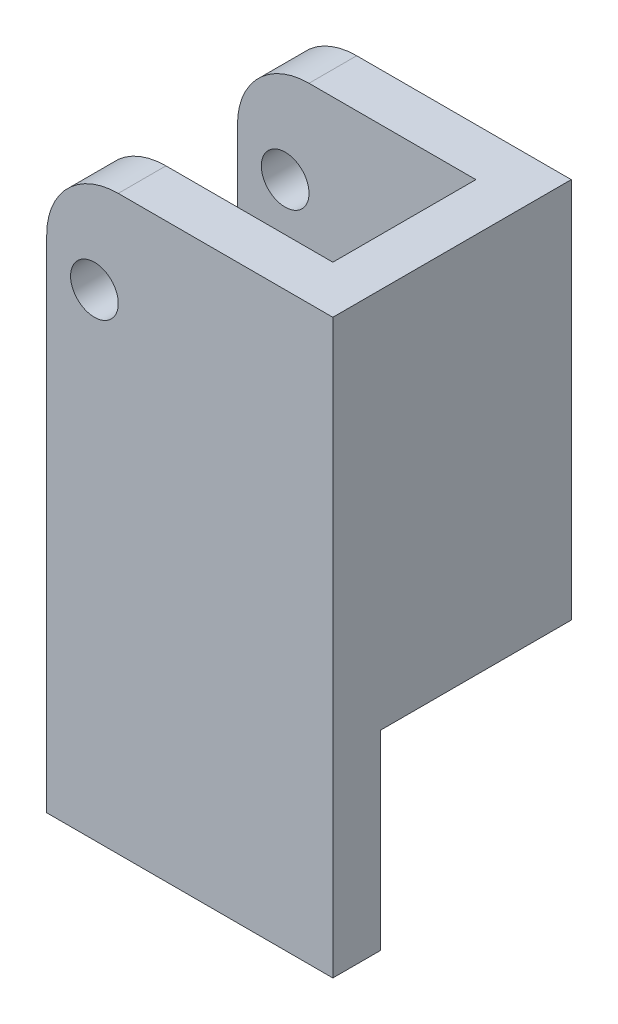
ISO-10303-21;
HEADER;
FILE_DESCRIPTION(('STEP AP214'),'2;1');
FILE_NAME('part.step','',(''),(''),'','','');
FILE_SCHEMA(('AUTOMOTIVE_DESIGN { 1 0 10303 214 1 1 1 1 }'));
ENDSEC;
DATA;
#1=APPLICATION_CONTEXT('core data for automotive mechanical design processes');
#2=APPLICATION_PROTOCOL_DEFINITION('international standard','automotive_design',2000,#1);
#3=PRODUCT_CONTEXT('',#1,'mechanical');
#4=PRODUCT('Part','Part','',(#3));
#5=PRODUCT_RELATED_PRODUCT_CATEGORY('part','',(#4));
#6=PRODUCT_DEFINITION_FORMATION('','',#4);
#7=PRODUCT_DEFINITION_CONTEXT('part definition',#1,'design');
#8=PRODUCT_DEFINITION('design','',#6,#7);
#9=PRODUCT_DEFINITION_SHAPE('','',#8);
#10=(LENGTH_UNIT() NAMED_UNIT(*) SI_UNIT(.MILLI.,.METRE.));
#11=(NAMED_UNIT(*) PLANE_ANGLE_UNIT() SI_UNIT($,.RADIAN.));
#12=(NAMED_UNIT(*) SI_UNIT($,.STERADIAN.) SOLID_ANGLE_UNIT());
#13=UNCERTAINTY_MEASURE_WITH_UNIT(LENGTH_MEASURE(1.E-05),#10,'distance_accuracy_value','');
#14=(GEOMETRIC_REPRESENTATION_CONTEXT(3) GLOBAL_UNCERTAINTY_ASSIGNED_CONTEXT((#13)) GLOBAL_UNIT_ASSIGNED_CONTEXT((#10,
#11,#12)) REPRESENTATION_CONTEXT('',''));
#15=CARTESIAN_POINT('',(0.,0.,0.));
#16=DIRECTION('',(0.,0.,1.));
#17=DIRECTION('',(1.,0.,0.));
#18=AXIS2_PLACEMENT_3D('',#15,#16,#17);
#19=CARTESIAN_POINT('',(31.75,0.,-6.35));
#20=DIRECTION('',(0.,0.,1.));
#21=DIRECTION('',(1.,0.,0.));
#22=AXIS2_PLACEMENT_3D('',#19,#20,#21);
#23=PLANE('',#22);
#24=DIRECTION('',(0.,1.,0.));
#25=VECTOR('',#24,1.);
#26=CARTESIAN_POINT('',(0.,0.,-6.35));
#27=LINE('',#26,#25);
#28=CARTESIAN_POINT('',(0.,0.,-6.35));
#29=VERTEX_POINT('',#28);
#30=CARTESIAN_POINT('',(0.,25.4,-6.35));
#31=VERTEX_POINT('',#30);
#32=EDGE_CURVE('E163',#29,#31,#27,.T.);
#33=ORIENTED_EDGE('',*,*,#32,.T.);
#34=DIRECTION('',(-1.,0.,0.));
#35=VECTOR('',#34,1.);
#36=CARTESIAN_POINT('',(38.1,25.4,-6.35));
#37=LINE('',#36,#35);
#38=CARTESIAN_POINT('',(38.1,25.4,-6.35));
#39=VERTEX_POINT('',#38);
#40=EDGE_CURVE('E56',#39,#31,#37,.T.);
#41=ORIENTED_EDGE('',*,*,#40,.F.);
#42=DIRECTION('',(0.,1.,0.));
#43=VECTOR('',#42,1.);
#44=CARTESIAN_POINT('',(38.1,0.,-6.35));
#45=LINE('',#44,#43);
#46=CARTESIAN_POINT('',(38.1,0.,-6.35));
#47=VERTEX_POINT('',#46);
#48=EDGE_CURVE('E140',#47,#39,#45,.T.);
#49=ORIENTED_EDGE('',*,*,#48,.F.);
#50=DIRECTION('',(-1.,0.,0.));
#51=VECTOR('',#50,1.);
#52=CARTESIAN_POINT('',(31.75,0.,-6.35));
#53=LINE('',#52,#51);
#54=EDGE_CURVE('E166',#47,#29,#53,.T.);
#55=ORIENTED_EDGE('',*,*,#54,.T.);
#56=EDGE_LOOP('',(#33,#41,#49,#55));
#57=FACE_BOUND('',#56,.T.);
#58=ADVANCED_FACE('F33',(#57),#23,.F.);
#59=CARTESIAN_POINT('',(0.,0.,-31.75));
#60=DIRECTION('',(-1.,0.,0.));
#61=DIRECTION('',(0.,0.,1.));
#62=AXIS2_PLACEMENT_3D('',#59,#60,#61);
#63=PLANE('',#62);
#64=DIRECTION('',(0.,-1.,0.));
#65=VECTOR('',#64,1.);
#66=CARTESIAN_POINT('',(0.,0.,0.));
#67=LINE('',#66,#65);
#68=CARTESIAN_POINT('',(0.,66.675,0.));
#69=VERTEX_POINT('',#68);
#70=CARTESIAN_POINT('',(0.,0.,0.));
#71=VERTEX_POINT('',#70);
#72=EDGE_CURVE('E171',#69,#71,#67,.T.);
#73=ORIENTED_EDGE('',*,*,#72,.F.);
#74=DIRECTION('',(0.,0.,1.));
#75=VECTOR('',#74,1.);
#76=CARTESIAN_POINT('',(0.,66.675,-31.75));
#77=LINE('',#76,#75);
#78=CARTESIAN_POINT('',(0.,66.675,-6.35));
#79=VERTEX_POINT('',#78);
#80=EDGE_CURVE('E207',#69,#79,#77,.F.);
#81=ORIENTED_EDGE('',*,*,#80,.T.);
#82=CARTESIAN_POINT('',(0.,31.75,-6.35));
#83=VERTEX_POINT('',#82);
#84=EDGE_CURVE('E131',#83,#79,#27,.T.);
#85=ORIENTED_EDGE('',*,*,#84,.F.);
#86=DIRECTION('',(0.,0.,-1.));
#87=VECTOR('',#86,1.);
#88=CARTESIAN_POINT('',(0.,31.75,-25.4));
#89=LINE('',#88,#87);
#90=CARTESIAN_POINT('',(0.,31.75,-25.4));
#91=VERTEX_POINT('',#90);
#92=EDGE_CURVE('E254',#83,#91,#89,.T.);
#93=ORIENTED_EDGE('',*,*,#92,.T.);
#94=DIRECTION('',(0.,1.,0.));
#95=VECTOR('',#94,1.);
#96=CARTESIAN_POINT('',(0.,25.4,-25.4));
#97=LINE('',#96,#95);
#98=CARTESIAN_POINT('',(0.,66.675,-25.4));
#99=VERTEX_POINT('',#98);
#100=EDGE_CURVE('E144',#91,#99,#97,.T.);
#101=ORIENTED_EDGE('',*,*,#100,.T.);
#102=DIRECTION('',(0.,0.,1.));
#103=VECTOR('',#102,1.);
#104=CARTESIAN_POINT('',(0.,66.675,0.));
#105=LINE('',#104,#103);
#106=CARTESIAN_POINT('',(0.,66.675,-31.75));
#107=VERTEX_POINT('',#106);
#108=EDGE_CURVE('E41',#99,#107,#105,.F.);
#109=ORIENTED_EDGE('',*,*,#108,.T.);
#110=DIRECTION('',(0.,1.,0.));
#111=VECTOR('',#110,1.);
#112=CARTESIAN_POINT('',(0.,25.4,-31.75));
#113=LINE('',#112,#111);
#114=CARTESIAN_POINT('',(0.,25.4,-31.75));
#115=VERTEX_POINT('',#114);
#116=EDGE_CURVE('E126',#115,#107,#113,.T.);
#117=ORIENTED_EDGE('',*,*,#116,.F.);
#118=DIRECTION('',(0.,0.,1.));
#119=VECTOR('',#118,1.);
#120=CARTESIAN_POINT('',(0.,25.4,0.));
#121=LINE('',#120,#119);
#122=EDGE_CURVE('E137',#115,#31,#121,.T.);
#123=ORIENTED_EDGE('',*,*,#122,.T.);
#124=ORIENTED_EDGE('',*,*,#32,.F.);
#125=DIRECTION('',(0.,0.,1.));
#126=VECTOR('',#125,1.);
#127=CARTESIAN_POINT('',(0.,0.,-31.75));
#128=LINE('',#127,#126);
#129=EDGE_CURVE('E178',#29,#71,#128,.T.);
#130=ORIENTED_EDGE('',*,*,#129,.T.);
#131=EDGE_LOOP('',(#73,#81,#85,#93,#101,#109,#117,#123,#124,#130));
#132=FACE_BOUND('',#131,.T.);
#133=ADVANCED_FACE('F135',(#132),#63,.T.);
#134=CARTESIAN_POINT('',(0.,76.2,-31.75));
#135=DIRECTION('',(0.,1.,0.));
#136=DIRECTION('',(0.,0.,1.));
#137=AXIS2_PLACEMENT_3D('',#134,#135,#136);
#138=PLANE('',#137);
#139=DIRECTION('',(-1.,0.,0.));
#140=VECTOR('',#139,1.);
#141=CARTESIAN_POINT('',(31.75,76.2,-6.35));
#142=LINE('',#141,#140);
#143=CARTESIAN_POINT('',(31.75,76.2,-6.35));
#144=VERTEX_POINT('',#143);
#145=CARTESIAN_POINT('',(9.525,76.2,-6.35));
#146=VERTEX_POINT('',#145);
#147=EDGE_CURVE('E168',#144,#146,#142,.T.);
#148=ORIENTED_EDGE('',*,*,#147,.T.);
#149=DIRECTION('',(0.,0.,1.));
#150=VECTOR('',#149,1.);
#151=CARTESIAN_POINT('',(9.525,76.2,-31.75));
#152=LINE('',#151,#150);
#153=CARTESIAN_POINT('',(9.525,76.2,0.));
#154=VERTEX_POINT('',#153);
#155=EDGE_CURVE('E202',#146,#154,#152,.T.);
#156=ORIENTED_EDGE('',*,*,#155,.T.);
#157=DIRECTION('',(-1.,0.,0.));
#158=VECTOR('',#157,1.);
#159=CARTESIAN_POINT('',(0.,76.2,0.));
#160=LINE('',#159,#158);
#161=CARTESIAN_POINT('',(38.1,76.2,0.));
#162=VERTEX_POINT('',#161);
#163=EDGE_CURVE('E175',#162,#154,#160,.T.);
#164=ORIENTED_EDGE('',*,*,#163,.F.);
#165=DIRECTION('',(0.,0.,1.));
#166=VECTOR('',#165,1.);
#167=CARTESIAN_POINT('',(38.1,76.2,-31.75));
#168=LINE('',#167,#166);
#169=CARTESIAN_POINT('',(38.1,76.2,-31.75));
#170=VERTEX_POINT('',#169);
#171=EDGE_CURVE('E188',#170,#162,#168,.T.);
#172=ORIENTED_EDGE('',*,*,#171,.F.);
#173=DIRECTION('',(-1.,0.,0.));
#174=VECTOR('',#173,1.);
#175=CARTESIAN_POINT('',(0.,76.2,-31.75));
#176=LINE('',#175,#174);
#177=CARTESIAN_POINT('',(9.525,76.2,-31.75));
#178=VERTEX_POINT('',#177);
#179=EDGE_CURVE('E174',#170,#178,#176,.T.);
#180=ORIENTED_EDGE('',*,*,#179,.T.);
#181=DIRECTION('',(0.,0.,1.));
#182=VECTOR('',#181,1.);
#183=CARTESIAN_POINT('',(9.525,76.2,-31.75));
#184=LINE('',#183,#182);
#185=CARTESIAN_POINT('',(9.525,76.2,-25.4));
#186=VERTEX_POINT('',#185);
#187=EDGE_CURVE('E190',#178,#186,#184,.T.);
#188=ORIENTED_EDGE('',*,*,#187,.T.);
#189=DIRECTION('',(1.,0.,0.));
#190=VECTOR('',#189,1.);
#191=CARTESIAN_POINT('',(0.,76.2,-25.4));
#192=LINE('',#191,#190);
#193=CARTESIAN_POINT('',(31.75,76.2,-25.4));
#194=VERTEX_POINT('',#193);
#195=EDGE_CURVE('E145',#186,#194,#192,.T.);
#196=ORIENTED_EDGE('',*,*,#195,.T.);
#197=DIRECTION('',(0.,0.,-1.));
#198=VECTOR('',#197,1.);
#199=CARTESIAN_POINT('',(31.75,76.2,-31.75));
#200=LINE('',#199,#198);
#201=EDGE_CURVE('E162',#144,#194,#200,.T.);
#202=ORIENTED_EDGE('',*,*,#201,.F.);
#203=EDGE_LOOP('',(#148,#156,#164,#172,#180,#188,#196,#202));
#204=FACE_BOUND('',#203,.T.);
#205=ADVANCED_FACE('F223',(#204),#138,.T.);
#206=CARTESIAN_POINT('',(38.1,0.,-31.75));
#207=DIRECTION('',(1.,0.,0.));
#208=DIRECTION('',(0.,0.,-1.));
#209=AXIS2_PLACEMENT_3D('',#206,#207,#208);
#210=PLANE('',#209);
#211=DIRECTION('',(0.,0.,-1.));
#212=VECTOR('',#211,1.);
#213=CARTESIAN_POINT('',(38.1,25.4,-31.75));
#214=LINE('',#213,#212);
#215=CARTESIAN_POINT('',(38.1,25.4,-31.75));
#216=VERTEX_POINT('',#215);
#217=EDGE_CURVE('E157',#39,#216,#214,.T.);
#218=ORIENTED_EDGE('',*,*,#217,.T.);
#219=DIRECTION('',(0.,1.,0.));
#220=VECTOR('',#219,1.);
#221=CARTESIAN_POINT('',(38.1,0.,-31.75));
#222=LINE('',#221,#220);
#223=EDGE_CURVE('E129',#216,#170,#222,.T.);
#224=ORIENTED_EDGE('',*,*,#223,.T.);
#225=ORIENTED_EDGE('',*,*,#171,.T.);
#226=DIRECTION('',(0.,1.,0.));
#227=VECTOR('',#226,1.);
#228=CARTESIAN_POINT('',(38.1,0.,0.));
#229=LINE('',#228,#227);
#230=CARTESIAN_POINT('',(38.1,0.,0.));
#231=VERTEX_POINT('',#230);
#232=EDGE_CURVE('E183',#231,#162,#229,.T.);
#233=ORIENTED_EDGE('',*,*,#232,.F.);
#234=DIRECTION('',(0.,0.,1.));
#235=VECTOR('',#234,1.);
#236=CARTESIAN_POINT('',(38.1,0.,-31.75));
#237=LINE('',#236,#235);
#238=EDGE_CURVE('E191',#47,#231,#237,.T.);
#239=ORIENTED_EDGE('',*,*,#238,.F.);
#240=ORIENTED_EDGE('',*,*,#48,.T.);
#241=EDGE_LOOP('',(#218,#224,#225,#233,#239,#240));
#242=FACE_BOUND('',#241,.T.);
#243=ADVANCED_FACE('F227',(#242),#210,.T.);
#244=CARTESIAN_POINT('',(0.,0.,-31.75));
#245=DIRECTION('',(0.,-1.,0.));
#246=DIRECTION('',(0.,0.,-1.));
#247=AXIS2_PLACEMENT_3D('',#244,#245,#246);
#248=PLANE('',#247);
#249=ORIENTED_EDGE('',*,*,#54,.F.);
#250=ORIENTED_EDGE('',*,*,#238,.T.);
#251=DIRECTION('',(1.,0.,0.));
#252=VECTOR('',#251,1.);
#253=CARTESIAN_POINT('',(0.,0.,0.));
#254=LINE('',#253,#252);
#255=EDGE_CURVE('E180',#71,#231,#254,.T.);
#256=ORIENTED_EDGE('',*,*,#255,.F.);
#257=ORIENTED_EDGE('',*,*,#129,.F.);
#258=EDGE_LOOP('',(#249,#250,#256,#257));
#259=FACE_BOUND('',#258,.T.);
#260=ADVANCED_FACE('F234',(#259),#248,.T.);
#261=CARTESIAN_POINT('',(0.,0.,-31.75));
#262=DIRECTION('',(0.,0.,-1.));
#263=DIRECTION('',(-1.,0.,0.));
#264=AXIS2_PLACEMENT_3D('',#261,#262,#263);
#265=PLANE('',#264);
#266=CARTESIAN_POINT('',(6.35,63.5,-31.75));
#267=DIRECTION('',(0.,0.,-1.));
#268=DIRECTION('',(-1.,0.,0.));
#269=AXIS2_PLACEMENT_3D('',#266,#267,#268);
#270=CIRCLE('',#269,3.175);
#271=CARTESIAN_POINT('',(3.175,63.5,-31.75));
#272=VERTEX_POINT('',#271);
#273=EDGE_CURVE('E199',#272,#272,#270,.T.);
#274=ORIENTED_EDGE('',*,*,#273,.F.);
#275=EDGE_LOOP('',(#274));
#276=FACE_BOUND('',#275,.T.);
#277=ORIENTED_EDGE('',*,*,#116,.T.);
#278=CARTESIAN_POINT('',(9.525,66.675,-31.75));
#279=DIRECTION('',(0.,0.,-1.));
#280=DIRECTION('',(-1.,0.,0.));
#281=AXIS2_PLACEMENT_3D('',#278,#279,#280);
#282=CIRCLE('',#281,9.525);
#283=EDGE_CURVE('E11',#107,#178,#282,.T.);
#284=ORIENTED_EDGE('',*,*,#283,.T.);
#285=ORIENTED_EDGE('',*,*,#179,.F.);
#286=ORIENTED_EDGE('',*,*,#223,.F.);
#287=DIRECTION('',(-1.,0.,0.));
#288=VECTOR('',#287,1.);
#289=CARTESIAN_POINT('',(38.1,25.4,-31.75));
#290=LINE('',#289,#288);
#291=EDGE_CURVE('E123',#216,#115,#290,.T.);
#292=ORIENTED_EDGE('',*,*,#291,.T.);
#293=EDGE_LOOP('',(#277,#284,#285,#286,#292));
#294=FACE_BOUND('',#293,.T.);
#295=ADVANCED_FACE('F125',(#276,#294),#265,.T.);
#296=CARTESIAN_POINT('',(0.,0.,0.));
#297=DIRECTION('',(0.,0.,-1.));
#298=DIRECTION('',(-1.,0.,0.));
#299=AXIS2_PLACEMENT_3D('',#296,#297,#298);
#300=PLANE('',#299);
#301=CARTESIAN_POINT('',(6.35,63.5,0.));
#302=DIRECTION('',(0.,0.,-1.));
#303=DIRECTION('',(-1.,0.,0.));
#304=AXIS2_PLACEMENT_3D('',#301,#302,#303);
#305=CIRCLE('',#304,3.175);
#306=CARTESIAN_POINT('',(3.175,63.5,0.));
#307=VERTEX_POINT('',#306);
#308=EDGE_CURVE('E149',#307,#307,#305,.T.);
#309=ORIENTED_EDGE('',*,*,#308,.T.);
#310=EDGE_LOOP('',(#309));
#311=FACE_BOUND('',#310,.T.);
#312=ORIENTED_EDGE('',*,*,#163,.T.);
#313=CARTESIAN_POINT('',(9.525,66.675,0.));
#314=DIRECTION('',(0.,0.,-1.));
#315=DIRECTION('',(-1.,0.,0.));
#316=AXIS2_PLACEMENT_3D('',#313,#314,#315);
#317=CIRCLE('',#316,9.525);
#318=EDGE_CURVE('E205',#154,#69,#317,.F.);
#319=ORIENTED_EDGE('',*,*,#318,.T.);
#320=ORIENTED_EDGE('',*,*,#72,.T.);
#321=ORIENTED_EDGE('',*,*,#255,.T.);
#322=ORIENTED_EDGE('',*,*,#232,.T.);
#323=EDGE_LOOP('',(#312,#319,#320,#321,#322));
#324=FACE_BOUND('',#323,.T.);
#325=ADVANCED_FACE('F230',(#311,#324),#300,.F.);
#326=CARTESIAN_POINT('',(6.35,63.5,-6.35));
#327=DIRECTION('',(0.,0.,1.));
#328=DIRECTION('',(1.,0.,0.));
#329=AXIS2_PLACEMENT_3D('',#326,#327,#328);
#330=CIRCLE('',#329,3.175);
#331=CARTESIAN_POINT('',(9.525,63.5,-6.35));
#332=VERTEX_POINT('',#331);
#333=EDGE_CURVE('E198',#332,#332,#330,.T.);
#334=ORIENTED_EDGE('',*,*,#333,.T.);
#335=EDGE_LOOP('',(#334));
#336=FACE_BOUND('',#335,.T.);
#337=DIRECTION('',(0.,1.,0.));
#338=VECTOR('',#337,1.);
#339=CARTESIAN_POINT('',(31.75,0.,-6.35));
#340=LINE('',#339,#338);
#341=CARTESIAN_POINT('',(31.75,31.75,-6.35));
#342=VERTEX_POINT('',#341);
#343=EDGE_CURVE('E160',#342,#144,#340,.T.);
#344=ORIENTED_EDGE('',*,*,#343,.F.);
#345=DIRECTION('',(-1.,0.,0.));
#346=VECTOR('',#345,1.);
#347=CARTESIAN_POINT('',(0.,31.75,-6.35));
#348=LINE('',#347,#346);
#349=EDGE_CURVE('E48',#342,#83,#348,.T.);
#350=ORIENTED_EDGE('',*,*,#349,.T.);
#351=ORIENTED_EDGE('',*,*,#84,.T.);
#352=CARTESIAN_POINT('',(9.525,66.675,-6.35));
#353=DIRECTION('',(0.,0.,1.));
#354=DIRECTION('',(1.,0.,0.));
#355=AXIS2_PLACEMENT_3D('',#352,#353,#354);
#356=CIRCLE('',#355,9.525);
#357=EDGE_CURVE('E210',#79,#146,#356,.F.);
#358=ORIENTED_EDGE('',*,*,#357,.T.);
#359=ORIENTED_EDGE('',*,*,#147,.F.);
#360=EDGE_LOOP('',(#344,#350,#351,#358,#359));
#361=FACE_BOUND('',#360,.T.);
#362=ADVANCED_FACE('F243',(#336,#361),#23,.F.);
#363=CARTESIAN_POINT('',(31.75,0.,0.));
#364=DIRECTION('',(1.,0.,0.));
#365=DIRECTION('',(0.,0.,-1.));
#366=AXIS2_PLACEMENT_3D('',#363,#364,#365);
#367=PLANE('',#366);
#368=DIRECTION('',(0.,1.,0.));
#369=VECTOR('',#368,1.);
#370=CARTESIAN_POINT('',(31.75,25.4,-25.4));
#371=LINE('',#370,#369);
#372=CARTESIAN_POINT('',(31.75,31.75,-25.4));
#373=VERTEX_POINT('',#372);
#374=EDGE_CURVE('E141',#373,#194,#371,.T.);
#375=ORIENTED_EDGE('',*,*,#374,.F.);
#376=DIRECTION('',(0.,0.,1.));
#377=VECTOR('',#376,1.);
#378=CARTESIAN_POINT('',(31.75,31.75,-25.4));
#379=LINE('',#378,#377);
#380=EDGE_CURVE('E249',#373,#342,#379,.T.);
#381=ORIENTED_EDGE('',*,*,#380,.T.);
#382=ORIENTED_EDGE('',*,*,#343,.T.);
#383=ORIENTED_EDGE('',*,*,#201,.T.);
#384=EDGE_LOOP('',(#375,#381,#382,#383));
#385=FACE_BOUND('',#384,.T.);
#386=ADVANCED_FACE('F247',(#385),#367,.F.);
#387=CARTESIAN_POINT('',(38.1,25.4,-31.75));
#388=DIRECTION('',(0.,1.,0.));
#389=DIRECTION('',(0.,0.,1.));
#390=AXIS2_PLACEMENT_3D('',#387,#388,#389);
#391=PLANE('',#390);
#392=ORIENTED_EDGE('',*,*,#40,.T.);
#393=ORIENTED_EDGE('',*,*,#122,.F.);
#394=ORIENTED_EDGE('',*,*,#291,.F.);
#395=ORIENTED_EDGE('',*,*,#217,.F.);
#396=EDGE_LOOP('',(#392,#393,#394,#395));
#397=FACE_BOUND('',#396,.T.);
#398=ADVANCED_FACE('F143',(#397),#391,.F.);
#399=CARTESIAN_POINT('',(0.,25.4,-25.4));
#400=DIRECTION('',(0.,0.,1.));
#401=DIRECTION('',(1.,0.,0.));
#402=AXIS2_PLACEMENT_3D('',#399,#400,#401);
#403=PLANE('',#402);
#404=DIRECTION('',(1.,0.,0.));
#405=VECTOR('',#404,1.);
#406=CARTESIAN_POINT('',(0.,31.75,-25.4));
#407=LINE('',#406,#405);
#408=EDGE_CURVE('E258',#91,#373,#407,.T.);
#409=ORIENTED_EDGE('',*,*,#408,.T.);
#410=ORIENTED_EDGE('',*,*,#374,.T.);
#411=ORIENTED_EDGE('',*,*,#195,.F.);
#412=CARTESIAN_POINT('',(9.525,66.675,-25.4));
#413=DIRECTION('',(0.,0.,1.));
#414=DIRECTION('',(1.,0.,0.));
#415=AXIS2_PLACEMENT_3D('',#412,#413,#414);
#416=CIRCLE('',#415,9.525);
#417=EDGE_CURVE('E212',#186,#99,#416,.T.);
#418=ORIENTED_EDGE('',*,*,#417,.T.);
#419=ORIENTED_EDGE('',*,*,#100,.F.);
#420=EDGE_LOOP('',(#409,#410,#411,#418,#419));
#421=FACE_BOUND('',#420,.T.);
#422=CARTESIAN_POINT('',(6.35,63.5,-25.4));
#423=DIRECTION('',(0.,0.,1.));
#424=DIRECTION('',(1.,0.,0.));
#425=AXIS2_PLACEMENT_3D('',#422,#423,#424);
#426=CIRCLE('',#425,3.175);
#427=CARTESIAN_POINT('',(9.525,63.5,-25.4));
#428=VERTEX_POINT('',#427);
#429=EDGE_CURVE('E195',#428,#428,#426,.T.);
#430=ORIENTED_EDGE('',*,*,#429,.F.);
#431=EDGE_LOOP('',(#430));
#432=FACE_BOUND('',#431,.T.);
#433=ADVANCED_FACE('F216',(#421,#432),#403,.T.);
#434=CARTESIAN_POINT('',(6.35,63.5,19.05));
#435=DIRECTION('',(0.,0.,-1.));
#436=DIRECTION('',(-1.,0.,0.));
#437=AXIS2_PLACEMENT_3D('',#434,#435,#436);
#438=CYLINDRICAL_SURFACE('',#437,3.175);
#439=ORIENTED_EDGE('',*,*,#429,.T.);
#440=EDGE_LOOP('',(#439));
#441=FACE_BOUND('',#440,.T.);
#442=ORIENTED_EDGE('',*,*,#273,.T.);
#443=EDGE_LOOP('',(#442));
#444=FACE_BOUND('',#443,.T.);
#445=ADVANCED_FACE('F270',(#441,#444),#438,.F.);
#446=ORIENTED_EDGE('',*,*,#333,.F.);
#447=EDGE_LOOP('',(#446));
#448=FACE_BOUND('',#447,.T.);
#449=ORIENTED_EDGE('',*,*,#308,.F.);
#450=EDGE_LOOP('',(#449));
#451=FACE_BOUND('',#450,.T.);
#452=ADVANCED_FACE('F268',(#448,#451),#438,.F.);
#453=CARTESIAN_POINT('',(9.525,66.675,-31.75));
#454=DIRECTION('',(0.,0.,1.));
#455=DIRECTION('',(1.,0.,0.));
#456=AXIS2_PLACEMENT_3D('',#453,#454,#455);
#457=CYLINDRICAL_SURFACE('',#456,9.525);
#458=ORIENTED_EDGE('',*,*,#357,.F.);
#459=ORIENTED_EDGE('',*,*,#80,.F.);
#460=ORIENTED_EDGE('',*,*,#318,.F.);
#461=ORIENTED_EDGE('',*,*,#155,.F.);
#462=EDGE_LOOP('',(#458,#459,#460,#461));
#463=FACE_BOUND('',#462,.T.);
#464=ADVANCED_FACE('F240',(#463),#457,.T.);
#465=CARTESIAN_POINT('',(9.525,66.675,-31.75));
#466=DIRECTION('',(0.,0.,1.));
#467=DIRECTION('',(1.,0.,0.));
#468=AXIS2_PLACEMENT_3D('',#465,#466,#467);
#469=CYLINDRICAL_SURFACE('',#468,9.525);
#470=ORIENTED_EDGE('',*,*,#283,.F.);
#471=ORIENTED_EDGE('',*,*,#108,.F.);
#472=ORIENTED_EDGE('',*,*,#417,.F.);
#473=ORIENTED_EDGE('',*,*,#187,.F.);
#474=EDGE_LOOP('',(#470,#471,#472,#473));
#475=FACE_BOUND('',#474,.T.);
#476=ADVANCED_FACE('F35',(#475),#469,.T.);
#477=CARTESIAN_POINT('',(0.,31.75,0.));
#478=DIRECTION('',(0.,1.,0.));
#479=DIRECTION('',(0.,0.,1.));
#480=AXIS2_PLACEMENT_3D('',#477,#478,#479);
#481=PLANE('',#480);
#482=ORIENTED_EDGE('',*,*,#92,.F.);
#483=ORIENTED_EDGE('',*,*,#349,.F.);
#484=ORIENTED_EDGE('',*,*,#380,.F.);
#485=ORIENTED_EDGE('',*,*,#408,.F.);
#486=EDGE_LOOP('',(#482,#483,#484,#485));
#487=FACE_BOUND('',#486,.T.);
#488=ADVANCED_FACE('F252',(#487),#481,.T.);
#489=CLOSED_SHELL('',(#58,#133,#205,#243,#260,#295,#325,#362,#386,#398,#433,#445,#452,#464,#476,#488));
#490=MANIFOLD_SOLID_BREP('B2',#489);
#491=ADVANCED_BREP_SHAPE_REPRESENTATION('',(#18,#490),#14);
#492=SHAPE_DEFINITION_REPRESENTATION(#9,#491);
ENDSEC;
END-ISO-10303-21;
